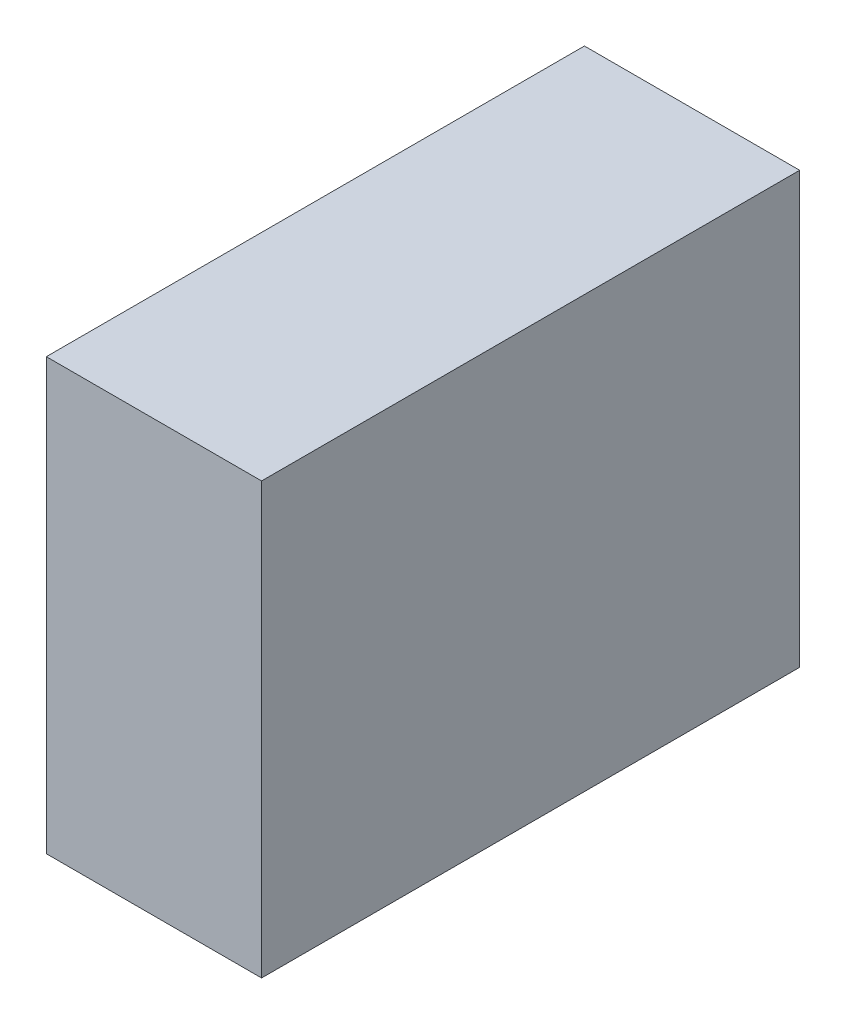
ISO-10303-21;
HEADER;
FILE_DESCRIPTION(('STEP AP214'),'2;1');
FILE_NAME('part.step','',(''),(''),'','','');
FILE_SCHEMA(('AUTOMOTIVE_DESIGN { 1 0 10303 214 1 1 1 1 }'));
ENDSEC;
DATA;
#1=APPLICATION_CONTEXT('core data for automotive mechanical design processes');
#2=APPLICATION_PROTOCOL_DEFINITION('international standard','automotive_design',2000,#1);
#3=PRODUCT_CONTEXT('',#1,'mechanical');
#4=PRODUCT('Part','Part','',(#3));
#5=PRODUCT_RELATED_PRODUCT_CATEGORY('part','',(#4));
#6=PRODUCT_DEFINITION_FORMATION('','',#4);
#7=PRODUCT_DEFINITION_CONTEXT('part definition',#1,'design');
#8=PRODUCT_DEFINITION('design','',#6,#7);
#9=PRODUCT_DEFINITION_SHAPE('','',#8);
#10=(LENGTH_UNIT() NAMED_UNIT(*) SI_UNIT(.MILLI.,.METRE.));
#11=(NAMED_UNIT(*) PLANE_ANGLE_UNIT() SI_UNIT($,.RADIAN.));
#12=(NAMED_UNIT(*) SI_UNIT($,.STERADIAN.) SOLID_ANGLE_UNIT());
#13=UNCERTAINTY_MEASURE_WITH_UNIT(LENGTH_MEASURE(1.E-05),#10,'distance_accuracy_value','');
#14=(GEOMETRIC_REPRESENTATION_CONTEXT(3) GLOBAL_UNCERTAINTY_ASSIGNED_CONTEXT((#13)) GLOBAL_UNIT_ASSIGNED_CONTEXT((#10,
#11,#12)) REPRESENTATION_CONTEXT('',''));
#15=CARTESIAN_POINT('',(0.,0.,0.));
#16=DIRECTION('',(0.,0.,1.));
#17=DIRECTION('',(1.,0.,0.));
#18=AXIS2_PLACEMENT_3D('',#15,#16,#17);
#19=CARTESIAN_POINT('',(2.,4.,10.));
#20=DIRECTION('',(-1.,0.,0.));
#21=DIRECTION('',(0.,-1.,0.));
#22=AXIS2_PLACEMENT_3D('',#19,#20,#21);
#23=PLANE('',#22);
#24=DIRECTION('',(0.,1.,0.));
#25=VECTOR('',#24,1.);
#26=CARTESIAN_POINT('',(2.,4.,0.));
#27=LINE('',#26,#25);
#28=CARTESIAN_POINT('',(2.,-4.,0.));
#29=VERTEX_POINT('',#28);
#30=CARTESIAN_POINT('',(2.,4.,0.));
#31=VERTEX_POINT('',#30);
#32=EDGE_CURVE('E96',#29,#31,#27,.T.);
#33=ORIENTED_EDGE('',*,*,#32,.T.);
#34=DIRECTION('',(0.,0.,-1.));
#35=VECTOR('',#34,1.);
#36=CARTESIAN_POINT('',(2.,4.,10.));
#37=LINE('',#36,#35);
#38=CARTESIAN_POINT('',(2.,4.,10.));
#39=VERTEX_POINT('',#38);
#40=EDGE_CURVE('E11',#39,#31,#37,.T.);
#41=ORIENTED_EDGE('',*,*,#40,.F.);
#42=DIRECTION('',(0.,1.,0.));
#43=VECTOR('',#42,1.);
#44=CARTESIAN_POINT('',(2.,4.,10.));
#45=LINE('',#44,#43);
#46=CARTESIAN_POINT('',(2.,-4.,10.));
#47=VERTEX_POINT('',#46);
#48=EDGE_CURVE('E84',#47,#39,#45,.T.);
#49=ORIENTED_EDGE('',*,*,#48,.F.);
#50=DIRECTION('',(0.,0.,-1.));
#51=VECTOR('',#50,1.);
#52=CARTESIAN_POINT('',(2.,-4.,10.));
#53=LINE('',#52,#51);
#54=EDGE_CURVE('E92',#47,#29,#53,.T.);
#55=ORIENTED_EDGE('',*,*,#54,.T.);
#56=EDGE_LOOP('',(#33,#41,#49,#55));
#57=FACE_BOUND('',#56,.T.);
#58=ADVANCED_FACE('F33',(#57),#23,.F.);
#59=CARTESIAN_POINT('',(-2.,4.,10.));
#60=DIRECTION('',(0.,-1.,0.));
#61=DIRECTION('',(0.,0.,-1.));
#62=AXIS2_PLACEMENT_3D('',#59,#60,#61);
#63=PLANE('',#62);
#64=DIRECTION('',(-1.,0.,0.));
#65=VECTOR('',#64,1.);
#66=CARTESIAN_POINT('',(-2.,4.,0.));
#67=LINE('',#66,#65);
#68=CARTESIAN_POINT('',(-2.,4.,0.));
#69=VERTEX_POINT('',#68);
#70=EDGE_CURVE('E88',#31,#69,#67,.T.);
#71=ORIENTED_EDGE('',*,*,#70,.T.);
#72=DIRECTION('',(0.,0.,-1.));
#73=VECTOR('',#72,1.);
#74=CARTESIAN_POINT('',(-2.,4.,10.));
#75=LINE('',#74,#73);
#76=CARTESIAN_POINT('',(-2.,4.,10.));
#77=VERTEX_POINT('',#76);
#78=EDGE_CURVE('E41',#77,#69,#75,.T.);
#79=ORIENTED_EDGE('',*,*,#78,.F.);
#80=DIRECTION('',(-1.,0.,0.));
#81=VECTOR('',#80,1.);
#82=CARTESIAN_POINT('',(-2.,4.,10.));
#83=LINE('',#82,#81);
#84=EDGE_CURVE('E79',#39,#77,#83,.T.);
#85=ORIENTED_EDGE('',*,*,#84,.F.);
#86=ORIENTED_EDGE('',*,*,#40,.T.);
#87=EDGE_LOOP('',(#71,#79,#85,#86));
#88=FACE_BOUND('',#87,.T.);
#89=ADVANCED_FACE('F87',(#88),#63,.F.);
#90=CARTESIAN_POINT('',(-2.,4.,10.));
#91=DIRECTION('',(1.,0.,0.));
#92=DIRECTION('',(0.,1.,0.));
#93=AXIS2_PLACEMENT_3D('',#90,#91,#92);
#94=PLANE('',#93);
#95=DIRECTION('',(0.,-1.,0.));
#96=VECTOR('',#95,1.);
#97=CARTESIAN_POINT('',(-2.,4.,0.));
#98=LINE('',#97,#96);
#99=CARTESIAN_POINT('',(-2.,-4.,0.));
#100=VERTEX_POINT('',#99);
#101=EDGE_CURVE('E66',#69,#100,#98,.T.);
#102=ORIENTED_EDGE('',*,*,#101,.T.);
#103=DIRECTION('',(0.,0.,-1.));
#104=VECTOR('',#103,1.);
#105=CARTESIAN_POINT('',(-2.,-4.,10.));
#106=LINE('',#105,#104);
#107=CARTESIAN_POINT('',(-2.,-4.,10.));
#108=VERTEX_POINT('',#107);
#109=EDGE_CURVE('E89',#108,#100,#106,.T.);
#110=ORIENTED_EDGE('',*,*,#109,.F.);
#111=DIRECTION('',(0.,-1.,0.));
#112=VECTOR('',#111,1.);
#113=CARTESIAN_POINT('',(-2.,4.,10.));
#114=LINE('',#113,#112);
#115=EDGE_CURVE('E82',#77,#108,#114,.T.);
#116=ORIENTED_EDGE('',*,*,#115,.F.);
#117=ORIENTED_EDGE('',*,*,#78,.T.);
#118=EDGE_LOOP('',(#102,#110,#116,#117));
#119=FACE_BOUND('',#118,.T.);
#120=ADVANCED_FACE('F90',(#119),#94,.F.);
#121=CARTESIAN_POINT('',(-2.,-4.,10.));
#122=DIRECTION('',(0.,1.,0.));
#123=DIRECTION('',(0.,0.,1.));
#124=AXIS2_PLACEMENT_3D('',#121,#122,#123);
#125=PLANE('',#124);
#126=DIRECTION('',(1.,0.,0.));
#127=VECTOR('',#126,1.);
#128=CARTESIAN_POINT('',(-2.,-4.,0.));
#129=LINE('',#128,#127);
#130=EDGE_CURVE('E72',#100,#29,#129,.T.);
#131=ORIENTED_EDGE('',*,*,#130,.T.);
#132=ORIENTED_EDGE('',*,*,#54,.F.);
#133=DIRECTION('',(1.,0.,0.));
#134=VECTOR('',#133,1.);
#135=CARTESIAN_POINT('',(-2.,-4.,10.));
#136=LINE('',#135,#134);
#137=EDGE_CURVE('E49',#108,#47,#136,.T.);
#138=ORIENTED_EDGE('',*,*,#137,.F.);
#139=ORIENTED_EDGE('',*,*,#109,.T.);
#140=EDGE_LOOP('',(#131,#132,#138,#139));
#141=FACE_BOUND('',#140,.T.);
#142=ADVANCED_FACE('F103',(#141),#125,.F.);
#143=CARTESIAN_POINT('',(0.,0.,10.));
#144=DIRECTION('',(0.,0.,1.));
#145=DIRECTION('',(1.,0.,0.));
#146=AXIS2_PLACEMENT_3D('',#143,#144,#145);
#147=PLANE('',#146);
#148=ORIENTED_EDGE('',*,*,#48,.T.);
#149=ORIENTED_EDGE('',*,*,#84,.T.);
#150=ORIENTED_EDGE('',*,*,#115,.T.);
#151=ORIENTED_EDGE('',*,*,#137,.T.);
#152=EDGE_LOOP('',(#148,#149,#150,#151));
#153=FACE_BOUND('',#152,.T.);
#154=ADVANCED_FACE('F80',(#153),#147,.T.);
#155=CARTESIAN_POINT('',(0.,0.,0.));
#156=DIRECTION('',(0.,0.,1.));
#157=DIRECTION('',(1.,0.,0.));
#158=AXIS2_PLACEMENT_3D('',#155,#156,#157);
#159=PLANE('',#158);
#160=ORIENTED_EDGE('',*,*,#32,.F.);
#161=ORIENTED_EDGE('',*,*,#130,.F.);
#162=ORIENTED_EDGE('',*,*,#101,.F.);
#163=ORIENTED_EDGE('',*,*,#70,.F.);
#164=EDGE_LOOP('',(#160,#161,#162,#163));
#165=FACE_BOUND('',#164,.T.);
#166=ADVANCED_FACE('F106',(#165),#159,.F.);
#167=CLOSED_SHELL('',(#58,#89,#120,#142,#154,#166));
#168=MANIFOLD_SOLID_BREP('B2',#167);
#169=ADVANCED_BREP_SHAPE_REPRESENTATION('',(#18,#168),#14);
#170=SHAPE_DEFINITION_REPRESENTATION(#9,#169);
ENDSEC;
END-ISO-10303-21;
